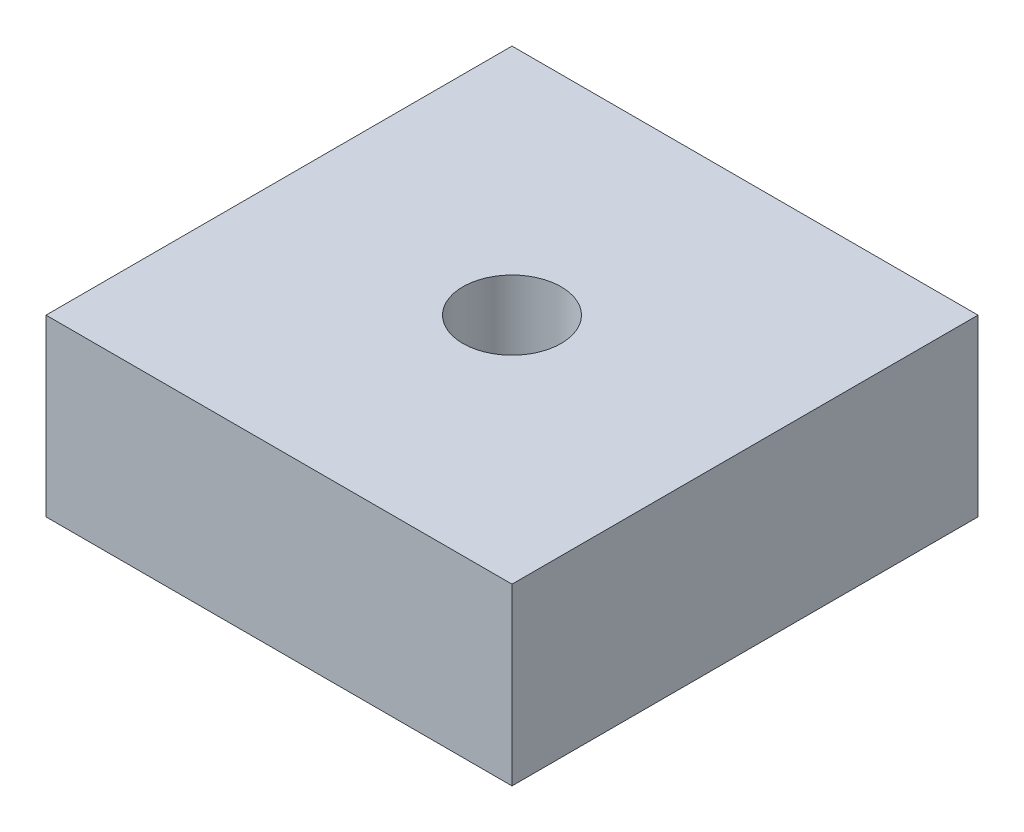
ISO-10303-21;
HEADER;
FILE_DESCRIPTION(('STEP AP214'),'2;1');
FILE_NAME('part.step','',(''),(''),'','','');
FILE_SCHEMA(('AUTOMOTIVE_DESIGN { 1 0 10303 214 1 1 1 1 }'));
ENDSEC;
DATA;
#1=APPLICATION_CONTEXT('core data for automotive mechanical design processes');
#2=APPLICATION_PROTOCOL_DEFINITION('international standard','automotive_design',2000,#1);
#3=PRODUCT_CONTEXT('',#1,'mechanical');
#4=PRODUCT('Part','Part','',(#3));
#5=PRODUCT_RELATED_PRODUCT_CATEGORY('part','',(#4));
#6=PRODUCT_DEFINITION_FORMATION('','',#4);
#7=PRODUCT_DEFINITION_CONTEXT('part definition',#1,'design');
#8=PRODUCT_DEFINITION('design','',#6,#7);
#9=PRODUCT_DEFINITION_SHAPE('','',#8);
#10=(LENGTH_UNIT() NAMED_UNIT(*) SI_UNIT(.MILLI.,.METRE.));
#11=(NAMED_UNIT(*) PLANE_ANGLE_UNIT() SI_UNIT($,.RADIAN.));
#12=(NAMED_UNIT(*) SI_UNIT($,.STERADIAN.) SOLID_ANGLE_UNIT());
#13=UNCERTAINTY_MEASURE_WITH_UNIT(LENGTH_MEASURE(1.E-05),#10,'distance_accuracy_value','');
#14=(GEOMETRIC_REPRESENTATION_CONTEXT(3) GLOBAL_UNCERTAINTY_ASSIGNED_CONTEXT((#13)) GLOBAL_UNIT_ASSIGNED_CONTEXT((#10,
#11,#12)) REPRESENTATION_CONTEXT('',''));
#15=CARTESIAN_POINT('',(0.,0.,0.));
#16=DIRECTION('',(0.,0.,1.));
#17=DIRECTION('',(1.,0.,0.));
#18=AXIS2_PLACEMENT_3D('',#15,#16,#17);
#19=CARTESIAN_POINT('',(0.,19.05,50.8));
#20=DIRECTION('',(0.,-1.,0.));
#21=DIRECTION('',(0.,0.,-1.));
#22=AXIS2_PLACEMENT_3D('',#19,#20,#21);
#23=PLANE('',#22);
#24=DIRECTION('',(-1.,0.,0.));
#25=VECTOR('',#24,1.);
#26=CARTESIAN_POINT('',(0.,19.05,0.));
#27=LINE('',#26,#25);
#28=CARTESIAN_POINT('',(50.7999999999999,19.05,0.));
#29=VERTEX_POINT('',#28);
#30=CARTESIAN_POINT('',(0.,19.05,0.));
#31=VERTEX_POINT('',#30);
#32=EDGE_CURVE('E102',#29,#31,#27,.T.);
#33=ORIENTED_EDGE('',*,*,#32,.T.);
#34=DIRECTION('',(0.,0.,-1.));
#35=VECTOR('',#34,1.);
#36=CARTESIAN_POINT('',(0.,19.05,50.8));
#37=LINE('',#36,#35);
#38=CARTESIAN_POINT('',(0.,19.05,50.8));
#39=VERTEX_POINT('',#38);
#40=EDGE_CURVE('E93',#39,#31,#37,.T.);
#41=ORIENTED_EDGE('',*,*,#40,.F.);
#42=DIRECTION('',(-1.,0.,0.));
#43=VECTOR('',#42,1.);
#44=CARTESIAN_POINT('',(0.,19.05,50.8));
#45=LINE('',#44,#43);
#46=CARTESIAN_POINT('',(50.7999999999999,19.05,50.8));
#47=VERTEX_POINT('',#46);
#48=EDGE_CURVE('E51',#47,#39,#45,.T.);
#49=ORIENTED_EDGE('',*,*,#48,.F.);
#50=DIRECTION('',(0.,0.,-1.));
#51=VECTOR('',#50,1.);
#52=CARTESIAN_POINT('',(50.7999999999999,19.05,50.8));
#53=LINE('',#52,#51);
#54=EDGE_CURVE('E110',#47,#29,#53,.T.);
#55=ORIENTED_EDGE('',*,*,#54,.T.);
#56=EDGE_LOOP('',(#33,#41,#49,#55));
#57=FACE_BOUND('',#56,.T.);
#58=CARTESIAN_POINT('',(25.4,19.05,25.4));
#59=DIRECTION('',(0.,1.,0.));
#60=DIRECTION('',(0.,0.,1.));
#61=AXIS2_PLACEMENT_3D('',#58,#59,#60);
#62=CIRCLE('',#61,5.35812999999999);
#63=CARTESIAN_POINT('',(25.4,19.05,30.75813));
#64=VERTEX_POINT('',#63);
#65=EDGE_CURVE('E97',#64,#64,#62,.T.);
#66=ORIENTED_EDGE('',*,*,#65,.F.);
#67=EDGE_LOOP('',(#66));
#68=FACE_BOUND('',#67,.T.);
#69=ADVANCED_FACE('F36',(#57,#68),#23,.F.);
#70=CARTESIAN_POINT('',(0.,0.,50.8));
#71=DIRECTION('',(1.,0.,0.));
#72=DIRECTION('',(0.,0.,-1.));
#73=AXIS2_PLACEMENT_3D('',#70,#71,#72);
#74=PLANE('',#73);
#75=DIRECTION('',(0.,-1.,0.));
#76=VECTOR('',#75,1.);
#77=CARTESIAN_POINT('',(0.,0.,0.));
#78=LINE('',#77,#76);
#79=CARTESIAN_POINT('',(0.,0.,0.));
#80=VERTEX_POINT('',#79);
#81=EDGE_CURVE('E81',#31,#80,#78,.T.);
#82=ORIENTED_EDGE('',*,*,#81,.T.);
#83=DIRECTION('',(0.,0.,-1.));
#84=VECTOR('',#83,1.);
#85=CARTESIAN_POINT('',(0.,0.,50.8));
#86=LINE('',#85,#84);
#87=CARTESIAN_POINT('',(0.,0.,50.8));
#88=VERTEX_POINT('',#87);
#89=EDGE_CURVE('E11',#88,#80,#86,.T.);
#90=ORIENTED_EDGE('',*,*,#89,.F.);
#91=DIRECTION('',(0.,-1.,0.));
#92=VECTOR('',#91,1.);
#93=CARTESIAN_POINT('',(0.,0.,50.8));
#94=LINE('',#93,#92);
#95=EDGE_CURVE('E104',#39,#88,#94,.T.);
#96=ORIENTED_EDGE('',*,*,#95,.F.);
#97=ORIENTED_EDGE('',*,*,#40,.T.);
#98=EDGE_LOOP('',(#82,#90,#96,#97));
#99=FACE_BOUND('',#98,.T.);
#100=ADVANCED_FACE('F38',(#99),#74,.F.);
#101=CARTESIAN_POINT('',(0.,0.,50.8));
#102=DIRECTION('',(0.,1.,0.));
#103=DIRECTION('',(0.,0.,1.));
#104=AXIS2_PLACEMENT_3D('',#101,#102,#103);
#105=PLANE('',#104);
#106=CARTESIAN_POINT('',(25.4,0.,25.4));
#107=DIRECTION('',(0.,1.,0.));
#108=DIRECTION('',(0.,0.,1.));
#109=AXIS2_PLACEMENT_3D('',#106,#107,#108);
#110=CIRCLE('',#109,5.35812999999999);
#111=CARTESIAN_POINT('',(25.4,0.,30.75813));
#112=VERTEX_POINT('',#111);
#113=EDGE_CURVE('E94',#112,#112,#110,.T.);
#114=ORIENTED_EDGE('',*,*,#113,.T.);
#115=EDGE_LOOP('',(#114));
#116=FACE_BOUND('',#115,.T.);
#117=DIRECTION('',(1.,0.,0.));
#118=VECTOR('',#117,1.);
#119=CARTESIAN_POINT('',(0.,0.,0.));
#120=LINE('',#119,#118);
#121=CARTESIAN_POINT('',(50.7999999999999,0.,0.));
#122=VERTEX_POINT('',#121);
#123=EDGE_CURVE('E77',#80,#122,#120,.T.);
#124=ORIENTED_EDGE('',*,*,#123,.T.);
#125=DIRECTION('',(0.,0.,-1.));
#126=VECTOR('',#125,1.);
#127=CARTESIAN_POINT('',(50.7999999999999,0.,50.8));
#128=LINE('',#127,#126);
#129=CARTESIAN_POINT('',(50.7999999999999,0.,50.8));
#130=VERTEX_POINT('',#129);
#131=EDGE_CURVE('E44',#130,#122,#128,.T.);
#132=ORIENTED_EDGE('',*,*,#131,.F.);
#133=DIRECTION('',(1.,0.,0.));
#134=VECTOR('',#133,1.);
#135=CARTESIAN_POINT('',(0.,0.,50.8));
#136=LINE('',#135,#134);
#137=EDGE_CURVE('E89',#88,#130,#136,.T.);
#138=ORIENTED_EDGE('',*,*,#137,.F.);
#139=ORIENTED_EDGE('',*,*,#89,.T.);
#140=EDGE_LOOP('',(#124,#132,#138,#139));
#141=FACE_BOUND('',#140,.T.);
#142=ADVANCED_FACE('F88',(#116,#141),#105,.F.);
#143=CARTESIAN_POINT('',(50.7999999999999,0.,50.8));
#144=DIRECTION('',(-1.,0.,0.));
#145=DIRECTION('',(0.,0.,1.));
#146=AXIS2_PLACEMENT_3D('',#143,#144,#145);
#147=PLANE('',#146);
#148=DIRECTION('',(0.,1.,0.));
#149=VECTOR('',#148,1.);
#150=CARTESIAN_POINT('',(50.7999999999999,0.,0.));
#151=LINE('',#150,#149);
#152=EDGE_CURVE('E82',#122,#29,#151,.T.);
#153=ORIENTED_EDGE('',*,*,#152,.T.);
#154=ORIENTED_EDGE('',*,*,#54,.F.);
#155=DIRECTION('',(0.,1.,0.));
#156=VECTOR('',#155,1.);
#157=CARTESIAN_POINT('',(50.7999999999999,0.,50.8));
#158=LINE('',#157,#156);
#159=EDGE_CURVE('E56',#130,#47,#158,.T.);
#160=ORIENTED_EDGE('',*,*,#159,.F.);
#161=ORIENTED_EDGE('',*,*,#131,.T.);
#162=EDGE_LOOP('',(#153,#154,#160,#161));
#163=FACE_BOUND('',#162,.T.);
#164=ADVANCED_FACE('F113',(#163),#147,.F.);
#165=CARTESIAN_POINT('',(0.,19.05,50.8));
#166=DIRECTION('',(0.,0.,-1.));
#167=DIRECTION('',(-1.,0.,0.));
#168=AXIS2_PLACEMENT_3D('',#165,#166,#167);
#169=PLANE('',#168);
#170=ORIENTED_EDGE('',*,*,#95,.T.);
#171=ORIENTED_EDGE('',*,*,#137,.T.);
#172=ORIENTED_EDGE('',*,*,#159,.T.);
#173=ORIENTED_EDGE('',*,*,#48,.T.);
#174=EDGE_LOOP('',(#170,#171,#172,#173));
#175=FACE_BOUND('',#174,.T.);
#176=ADVANCED_FACE('F116',(#175),#169,.F.);
#177=CARTESIAN_POINT('',(0.,19.05,0.));
#178=DIRECTION('',(0.,0.,-1.));
#179=DIRECTION('',(-1.,0.,0.));
#180=AXIS2_PLACEMENT_3D('',#177,#178,#179);
#181=PLANE('',#180);
#182=ORIENTED_EDGE('',*,*,#81,.F.);
#183=ORIENTED_EDGE('',*,*,#32,.F.);
#184=ORIENTED_EDGE('',*,*,#152,.F.);
#185=ORIENTED_EDGE('',*,*,#123,.F.);
#186=EDGE_LOOP('',(#182,#183,#184,#185));
#187=FACE_BOUND('',#186,.T.);
#188=ADVANCED_FACE('F78',(#187),#181,.T.);
#189=CARTESIAN_POINT('',(25.4,19.05,25.4));
#190=DIRECTION('',(0.,1.,0.));
#191=DIRECTION('',(0.,0.,1.));
#192=AXIS2_PLACEMENT_3D('',#189,#190,#191);
#193=CYLINDRICAL_SURFACE('',#192,5.35812999999999);
#194=ORIENTED_EDGE('',*,*,#113,.F.);
#195=EDGE_LOOP('',(#194));
#196=FACE_BOUND('',#195,.T.);
#197=ORIENTED_EDGE('',*,*,#65,.T.);
#198=EDGE_LOOP('',(#197));
#199=FACE_BOUND('',#198,.T.);
#200=ADVANCED_FACE('F123',(#196,#199),#193,.F.);
#201=CLOSED_SHELL('',(#69,#100,#142,#164,#176,#188,#200));
#202=MANIFOLD_SOLID_BREP('B2',#201);
#203=ADVANCED_BREP_SHAPE_REPRESENTATION('',(#18,#202),#14);
#204=SHAPE_DEFINITION_REPRESENTATION(#9,#203);
ENDSEC;
END-ISO-10303-21;
